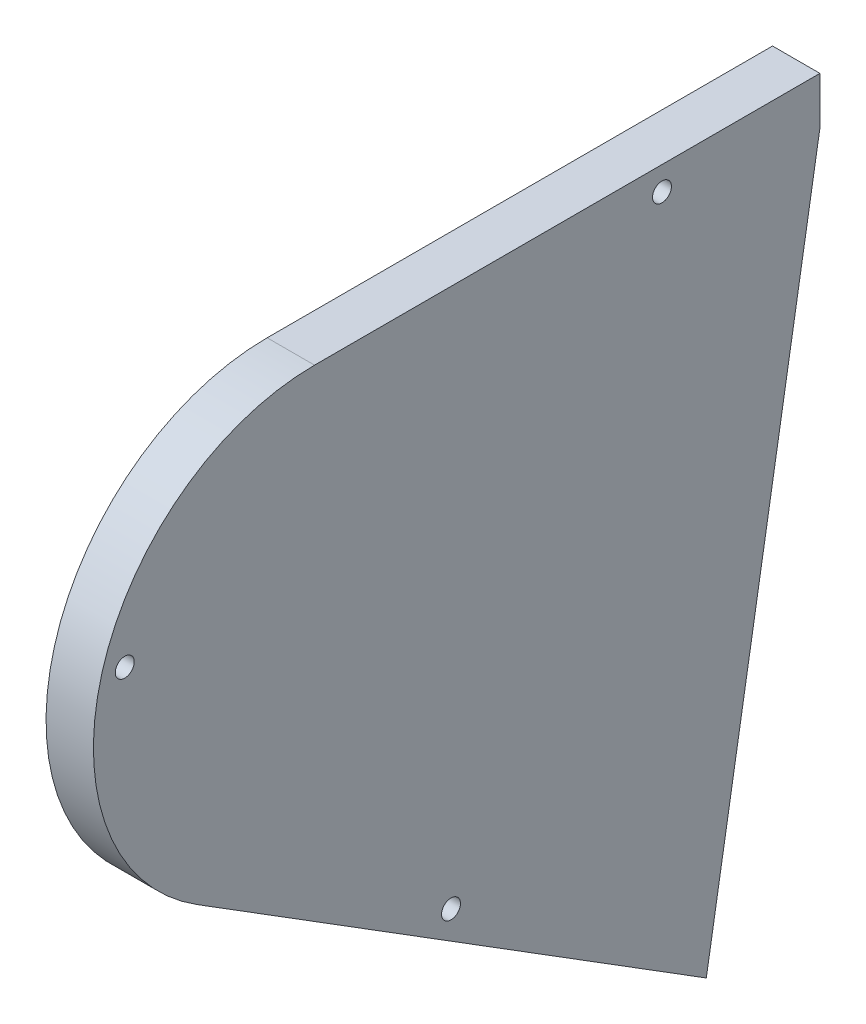
ISO-10303-21;
HEADER;
FILE_DESCRIPTION(('STEP AP214'),'2;1');
FILE_NAME('part.step','',(''),(''),'','','');
FILE_SCHEMA(('AUTOMOTIVE_DESIGN { 1 0 10303 214 1 1 1 1 }'));
ENDSEC;
DATA;
#1=APPLICATION_CONTEXT('core data for automotive mechanical design processes');
#2=APPLICATION_PROTOCOL_DEFINITION('international standard','automotive_design',2000,#1);
#3=PRODUCT_CONTEXT('',#1,'mechanical');
#4=PRODUCT('Part','Part','',(#3));
#5=PRODUCT_RELATED_PRODUCT_CATEGORY('part','',(#4));
#6=PRODUCT_DEFINITION_FORMATION('','',#4);
#7=PRODUCT_DEFINITION_CONTEXT('part definition',#1,'design');
#8=PRODUCT_DEFINITION('design','',#6,#7);
#9=PRODUCT_DEFINITION_SHAPE('','',#8);
#10=(LENGTH_UNIT() NAMED_UNIT(*) SI_UNIT(.MILLI.,.METRE.));
#11=(NAMED_UNIT(*) PLANE_ANGLE_UNIT() SI_UNIT($,.RADIAN.));
#12=(NAMED_UNIT(*) SI_UNIT($,.STERADIAN.) SOLID_ANGLE_UNIT());
#13=UNCERTAINTY_MEASURE_WITH_UNIT(LENGTH_MEASURE(1.E-05),#10,'distance_accuracy_value','');
#14=(GEOMETRIC_REPRESENTATION_CONTEXT(3) GLOBAL_UNCERTAINTY_ASSIGNED_CONTEXT((#13)) GLOBAL_UNIT_ASSIGNED_CONTEXT((#10,
#11,#12)) REPRESENTATION_CONTEXT('',''));
#15=CARTESIAN_POINT('',(0.,0.,0.));
#16=DIRECTION('',(0.,0.,1.));
#17=DIRECTION('',(1.,0.,0.));
#18=AXIS2_PLACEMENT_3D('',#15,#16,#17);
#19=CARTESIAN_POINT('',(-1.5,3.,0.));
#20=DIRECTION('',(1.,0.,0.));
#21=DIRECTION('',(0.,0.,-1.));
#22=AXIS2_PLACEMENT_3D('',#19,#20,#21);
#23=PLANE('',#22);
#24=CARTESIAN_POINT('',(-1.5,-7.5545330522875,44.015771199229));
#25=DIRECTION('',(1.,0.,0.));
#26=DIRECTION('',(0.,0.,-1.));
#27=AXIS2_PLACEMENT_3D('',#24,#25,#26);
#28=CIRCLE('',#27,0.6);
#29=CARTESIAN_POINT('',(-1.5,-7.5545330522875,43.415771199229));
#30=VERTEX_POINT('',#29);
#31=EDGE_CURVE('E154',#30,#30,#28,.T.);
#32=ORIENTED_EDGE('',*,*,#31,.T.);
#33=EDGE_LOOP('',(#32));
#34=FACE_BOUND('',#33,.T.);
#35=CARTESIAN_POINT('',(-1.5,-31.139147958153,23.3591250720994));
#36=DIRECTION('',(1.,0.,0.));
#37=DIRECTION('',(0.,0.,-1.));
#38=AXIS2_PLACEMENT_3D('',#35,#36,#37);
#39=CIRCLE('',#38,0.6);
#40=CARTESIAN_POINT('',(-1.5,-31.139147958153,22.7591250720994));
#41=VERTEX_POINT('',#40);
#42=EDGE_CURVE('E159',#41,#41,#39,.T.);
#43=ORIENTED_EDGE('',*,*,#42,.T.);
#44=EDGE_LOOP('',(#43));
#45=FACE_BOUND('',#44,.T.);
#46=CARTESIAN_POINT('',(-1.5,1.5,10.));
#47=DIRECTION('',(1.,0.,0.));
#48=DIRECTION('',(0.,0.,-1.));
#49=AXIS2_PLACEMENT_3D('',#46,#47,#48);
#50=CIRCLE('',#49,0.6);
#51=CARTESIAN_POINT('',(-1.5,1.5,9.40000000000001));
#52=VERTEX_POINT('',#51);
#53=EDGE_CURVE('E164',#52,#52,#50,.T.);
#54=ORIENTED_EDGE('',*,*,#53,.T.);
#55=EDGE_LOOP('',(#54));
#56=FACE_BOUND('',#55,.T.);
#57=DIRECTION('',(0.,0.986301639513488,-0.164951738072098));
#58=VECTOR('',#57,1.);
#59=CARTESIAN_POINT('',(-1.5,0.,0.));
#60=LINE('',#59,#58);
#61=CARTESIAN_POINT('',(-1.5,-43.0096053870518,7.19304204532072));
#62=VERTEX_POINT('',#61);
#63=CARTESIAN_POINT('',(-1.5,0.,0.));
#64=VERTEX_POINT('',#63);
#65=EDGE_CURVE('E150',#62,#64,#60,.T.);
#66=ORIENTED_EDGE('',*,*,#65,.F.);
#67=DIRECTION('',(0.,0.529919264233206,0.848048096156425));
#68=VECTOR('',#67,1.);
#69=CARTESIAN_POINT('',(-1.49999999999999,-22.87267334619,39.4188696992649));
#70=LINE('',#69,#68);
#71=CARTESIAN_POINT('',(-1.5,-22.87267334619,39.4188696992649));
#72=VERTEX_POINT('',#71);
#73=EDGE_CURVE('E129',#62,#72,#70,.T.);
#74=ORIENTED_EDGE('',*,*,#73,.T.);
#75=CARTESIAN_POINT('',(-1.5,-11.,32.));
#76=DIRECTION('',(1.,0.,0.));
#77=DIRECTION('',(0.,0.,-1.));
#78=AXIS2_PLACEMENT_3D('',#75,#76,#77);
#79=CIRCLE('',#78,14.);
#80=CARTESIAN_POINT('',(-1.5,3.,32.));
#81=VERTEX_POINT('',#80);
#82=EDGE_CURVE('E131',#72,#81,#79,.F.);
#83=ORIENTED_EDGE('',*,*,#82,.T.);
#84=DIRECTION('',(0.,0.,1.));
#85=VECTOR('',#84,1.);
#86=CARTESIAN_POINT('',(-1.5,3.,0.));
#87=LINE('',#86,#85);
#88=CARTESIAN_POINT('',(-1.5,3.,0.));
#89=VERTEX_POINT('',#88);
#90=EDGE_CURVE('E115',#89,#81,#87,.T.);
#91=ORIENTED_EDGE('',*,*,#90,.F.);
#92=DIRECTION('',(0.,-1.,0.));
#93=VECTOR('',#92,1.);
#94=CARTESIAN_POINT('',(-1.5,3.,0.));
#95=LINE('',#94,#93);
#96=EDGE_CURVE('E74',#89,#64,#95,.T.);
#97=ORIENTED_EDGE('',*,*,#96,.T.);
#98=EDGE_LOOP('',(#66,#74,#83,#91,#97));
#99=FACE_BOUND('',#98,.T.);
#100=ADVANCED_FACE('F65',(#34,#45,#56,#99),#23,.F.);
#101=CARTESIAN_POINT('',(1.5,3.,0.));
#102=DIRECTION('',(-1.,0.,0.));
#103=DIRECTION('',(0.,0.,1.));
#104=AXIS2_PLACEMENT_3D('',#101,#102,#103);
#105=PLANE('',#104);
#106=CARTESIAN_POINT('',(1.5,-7.5545330522875,44.015771199229));
#107=DIRECTION('',(1.,0.,0.));
#108=DIRECTION('',(0.,0.,-1.));
#109=AXIS2_PLACEMENT_3D('',#106,#107,#108);
#110=CIRCLE('',#109,0.6);
#111=CARTESIAN_POINT('',(1.5,-7.5545330522875,43.415771199229));
#112=VERTEX_POINT('',#111);
#113=EDGE_CURVE('E169',#112,#112,#110,.T.);
#114=ORIENTED_EDGE('',*,*,#113,.F.);
#115=EDGE_LOOP('',(#114));
#116=FACE_BOUND('',#115,.T.);
#117=CARTESIAN_POINT('',(1.5,-31.139147958153,23.3591250720994));
#118=DIRECTION('',(1.,0.,0.));
#119=DIRECTION('',(0.,0.,-1.));
#120=AXIS2_PLACEMENT_3D('',#117,#118,#119);
#121=CIRCLE('',#120,0.6);
#122=CARTESIAN_POINT('',(1.5,-31.139147958153,22.7591250720994));
#123=VERTEX_POINT('',#122);
#124=EDGE_CURVE('E173',#123,#123,#121,.T.);
#125=ORIENTED_EDGE('',*,*,#124,.F.);
#126=EDGE_LOOP('',(#125));
#127=FACE_BOUND('',#126,.T.);
#128=CARTESIAN_POINT('',(1.5,1.5,10.));
#129=DIRECTION('',(1.,0.,0.));
#130=DIRECTION('',(0.,0.,-1.));
#131=AXIS2_PLACEMENT_3D('',#128,#129,#130);
#132=CIRCLE('',#131,0.6);
#133=CARTESIAN_POINT('',(1.5,1.5,9.40000000000001));
#134=VERTEX_POINT('',#133);
#135=EDGE_CURVE('E170',#134,#134,#132,.T.);
#136=ORIENTED_EDGE('',*,*,#135,.F.);
#137=EDGE_LOOP('',(#136));
#138=FACE_BOUND('',#137,.T.);
#139=DIRECTION('',(0.,-0.529919264233206,-0.848048096156425));
#140=VECTOR('',#139,1.);
#141=CARTESIAN_POINT('',(1.49999999999999,-22.87267334619,39.4188696992649));
#142=LINE('',#141,#140);
#143=CARTESIAN_POINT('',(1.49999999999999,-22.87267334619,39.4188696992649));
#144=VERTEX_POINT('',#143);
#145=CARTESIAN_POINT('',(1.500006,-43.0096053870518,7.19304204532072));
#146=VERTEX_POINT('',#145);
#147=EDGE_CURVE('E146',#144,#146,#142,.T.);
#148=ORIENTED_EDGE('',*,*,#147,.T.);
#149=DIRECTION('',(0.,-0.986301639513488,0.164951738072098));
#150=VECTOR('',#149,1.);
#151=CARTESIAN_POINT('',(1.5,0.,0.));
#152=LINE('',#151,#150);
#153=CARTESIAN_POINT('',(1.5,0.,0.));
#154=VERTEX_POINT('',#153);
#155=EDGE_CURVE('E152',#154,#146,#152,.T.);
#156=ORIENTED_EDGE('',*,*,#155,.F.);
#157=DIRECTION('',(0.,-1.,0.));
#158=VECTOR('',#157,1.);
#159=CARTESIAN_POINT('',(1.5,3.,0.));
#160=LINE('',#159,#158);
#161=CARTESIAN_POINT('',(1.5,3.,0.));
#162=VERTEX_POINT('',#161);
#163=EDGE_CURVE('E12',#162,#154,#160,.T.);
#164=ORIENTED_EDGE('',*,*,#163,.F.);
#165=DIRECTION('',(0.,0.,-1.));
#166=VECTOR('',#165,1.);
#167=CARTESIAN_POINT('',(1.5,3.,0.));
#168=LINE('',#167,#166);
#169=CARTESIAN_POINT('',(1.5,3.,32.));
#170=VERTEX_POINT('',#169);
#171=EDGE_CURVE('E113',#170,#162,#168,.T.);
#172=ORIENTED_EDGE('',*,*,#171,.F.);
#173=CARTESIAN_POINT('',(1.49999999999999,-11.,32.));
#174=DIRECTION('',(1.,0.,0.));
#175=DIRECTION('',(0.,0.,-1.));
#176=AXIS2_PLACEMENT_3D('',#173,#174,#175);
#177=CIRCLE('',#176,14.);
#178=EDGE_CURVE('E125',#170,#144,#177,.T.);
#179=ORIENTED_EDGE('',*,*,#178,.T.);
#180=EDGE_LOOP('',(#148,#156,#164,#172,#179));
#181=FACE_BOUND('',#180,.T.);
#182=ADVANCED_FACE('F124',(#116,#127,#138,#181),#105,.F.);
#183=CARTESIAN_POINT('',(-1.5,3.,0.));
#184=DIRECTION('',(0.,0.,1.));
#185=DIRECTION('',(1.,0.,0.));
#186=AXIS2_PLACEMENT_3D('',#183,#184,#185);
#187=PLANE('',#186);
#188=DIRECTION('',(-1.,0.,0.));
#189=VECTOR('',#188,1.);
#190=CARTESIAN_POINT('',(-1.5,0.,0.));
#191=LINE('',#190,#189);
#192=EDGE_CURVE('E138',#154,#64,#191,.T.);
#193=ORIENTED_EDGE('',*,*,#192,.T.);
#194=ORIENTED_EDGE('',*,*,#96,.F.);
#195=DIRECTION('',(-1.,0.,0.));
#196=VECTOR('',#195,1.);
#197=CARTESIAN_POINT('',(-1.5,3.,0.));
#198=LINE('',#197,#196);
#199=EDGE_CURVE('E83',#162,#89,#198,.T.);
#200=ORIENTED_EDGE('',*,*,#199,.F.);
#201=ORIENTED_EDGE('',*,*,#163,.T.);
#202=EDGE_LOOP('',(#193,#194,#200,#201));
#203=FACE_BOUND('',#202,.T.);
#204=ADVANCED_FACE('F184',(#203),#187,.F.);
#205=CARTESIAN_POINT('',(0.,3.,0.));
#206=DIRECTION('',(0.,1.,0.));
#207=DIRECTION('',(0.,0.,1.));
#208=AXIS2_PLACEMENT_3D('',#205,#206,#207);
#209=PLANE('',#208);
#210=ORIENTED_EDGE('',*,*,#90,.T.);
#211=DIRECTION('',(1.,0.,0.));
#212=VECTOR('',#211,1.);
#213=CARTESIAN_POINT('',(-1.5,3.,32.));
#214=LINE('',#213,#212);
#215=EDGE_CURVE('E110',#81,#170,#214,.T.);
#216=ORIENTED_EDGE('',*,*,#215,.T.);
#217=ORIENTED_EDGE('',*,*,#171,.T.);
#218=ORIENTED_EDGE('',*,*,#199,.T.);
#219=EDGE_LOOP('',(#210,#216,#217,#218));
#220=FACE_BOUND('',#219,.T.);
#221=ADVANCED_FACE('F112',(#220),#209,.T.);
#222=CARTESIAN_POINT('',(-42.217625698906,-11.,32.));
#223=DIRECTION('',(1.,0.,0.));
#224=DIRECTION('',(0.,0.,-1.));
#225=AXIS2_PLACEMENT_3D('',#222,#223,#224);
#226=CYLINDRICAL_SURFACE('',#225,14.);
#227=ORIENTED_EDGE('',*,*,#82,.F.);
#228=DIRECTION('',(1.,0.,0.));
#229=VECTOR('',#228,1.);
#230=CARTESIAN_POINT('',(-42.217625698906,-22.87267334619,39.4188696992649));
#231=LINE('',#230,#229);
#232=EDGE_CURVE('E102',#72,#144,#231,.T.);
#233=ORIENTED_EDGE('',*,*,#232,.T.);
#234=ORIENTED_EDGE('',*,*,#178,.F.);
#235=ORIENTED_EDGE('',*,*,#215,.F.);
#236=EDGE_LOOP('',(#227,#233,#234,#235));
#237=FACE_BOUND('',#236,.T.);
#238=ADVANCED_FACE('F128',(#237),#226,.T.);
#239=CARTESIAN_POINT('',(-42.217625698906,-22.87267334619,39.4188696992649));
#240=DIRECTION('',(0.,-0.848048096156425,0.529919264233206));
#241=DIRECTION('',(0.,-0.529919264233206,-0.848048096156425));
#242=AXIS2_PLACEMENT_3D('',#239,#240,#241);
#243=PLANE('',#242);
#244=ORIENTED_EDGE('',*,*,#73,.F.);
#245=DIRECTION('',(1.,0.,0.));
#246=VECTOR('',#245,1.);
#247=CARTESIAN_POINT('',(-42.217625698906,-43.0096053870518,7.19304204532071));
#248=LINE('',#247,#246);
#249=EDGE_CURVE('E133',#62,#146,#248,.T.);
#250=ORIENTED_EDGE('',*,*,#249,.T.);
#251=ORIENTED_EDGE('',*,*,#147,.F.);
#252=ORIENTED_EDGE('',*,*,#232,.F.);
#253=EDGE_LOOP('',(#244,#250,#251,#252));
#254=FACE_BOUND('',#253,.T.);
#255=ADVANCED_FACE('F202',(#254),#243,.T.);
#256=CARTESIAN_POINT('',(-66.5606162580115,0.,0.));
#257=DIRECTION('',(0.,0.164951738072098,0.986301639513488));
#258=DIRECTION('',(0.,-0.986301639513488,0.164951738072098));
#259=AXIS2_PLACEMENT_3D('',#256,#257,#258);
#260=PLANE('',#259);
#261=ORIENTED_EDGE('',*,*,#155,.T.);
#262=ORIENTED_EDGE('',*,*,#249,.F.);
#263=ORIENTED_EDGE('',*,*,#65,.T.);
#264=ORIENTED_EDGE('',*,*,#192,.F.);
#265=EDGE_LOOP('',(#261,#262,#263,#264));
#266=FACE_BOUND('',#265,.T.);
#267=ADVANCED_FACE('F193',(#266),#260,.F.);
#268=CARTESIAN_POINT('',(-1.500025,1.5,10.));
#269=DIRECTION('',(1.,0.,0.));
#270=DIRECTION('',(0.,0.,-1.));
#271=AXIS2_PLACEMENT_3D('',#268,#269,#270);
#272=CYLINDRICAL_SURFACE('',#271,0.6);
#273=ORIENTED_EDGE('',*,*,#135,.T.);
#274=EDGE_LOOP('',(#273));
#275=FACE_BOUND('',#274,.T.);
#276=ORIENTED_EDGE('',*,*,#53,.F.);
#277=EDGE_LOOP('',(#276));
#278=FACE_BOUND('',#277,.T.);
#279=ADVANCED_FACE('F189',(#275,#278),#272,.F.);
#280=CARTESIAN_POINT('',(-1.500025,-31.139147958153,23.3591250720994));
#281=DIRECTION('',(1.,0.,0.));
#282=DIRECTION('',(0.,0.,-1.));
#283=AXIS2_PLACEMENT_3D('',#280,#281,#282);
#284=CYLINDRICAL_SURFACE('',#283,0.6);
#285=ORIENTED_EDGE('',*,*,#124,.T.);
#286=EDGE_LOOP('',(#285));
#287=FACE_BOUND('',#286,.T.);
#288=ORIENTED_EDGE('',*,*,#42,.F.);
#289=EDGE_LOOP('',(#288));
#290=FACE_BOUND('',#289,.T.);
#291=ADVANCED_FACE('F192',(#287,#290),#284,.F.);
#292=CARTESIAN_POINT('',(-1.500025,-7.5545330522875,44.015771199229));
#293=DIRECTION('',(1.,0.,0.));
#294=DIRECTION('',(0.,0.,-1.));
#295=AXIS2_PLACEMENT_3D('',#292,#293,#294);
#296=CYLINDRICAL_SURFACE('',#295,0.6);
#297=ORIENTED_EDGE('',*,*,#113,.T.);
#298=EDGE_LOOP('',(#297));
#299=FACE_BOUND('',#298,.T.);
#300=ORIENTED_EDGE('',*,*,#31,.F.);
#301=EDGE_LOOP('',(#300));
#302=FACE_BOUND('',#301,.T.);
#303=ADVANCED_FACE('F179',(#299,#302),#296,.F.);
#304=CLOSED_SHELL('',(#100,#182,#204,#221,#238,#255,#267,#279,#291,#303));
#305=MANIFOLD_SOLID_BREP('B2',#304);
#306=ADVANCED_BREP_SHAPE_REPRESENTATION('',(#18,#305),#14);
#307=SHAPE_DEFINITION_REPRESENTATION(#9,#306);
ENDSEC;
END-ISO-10303-21;
